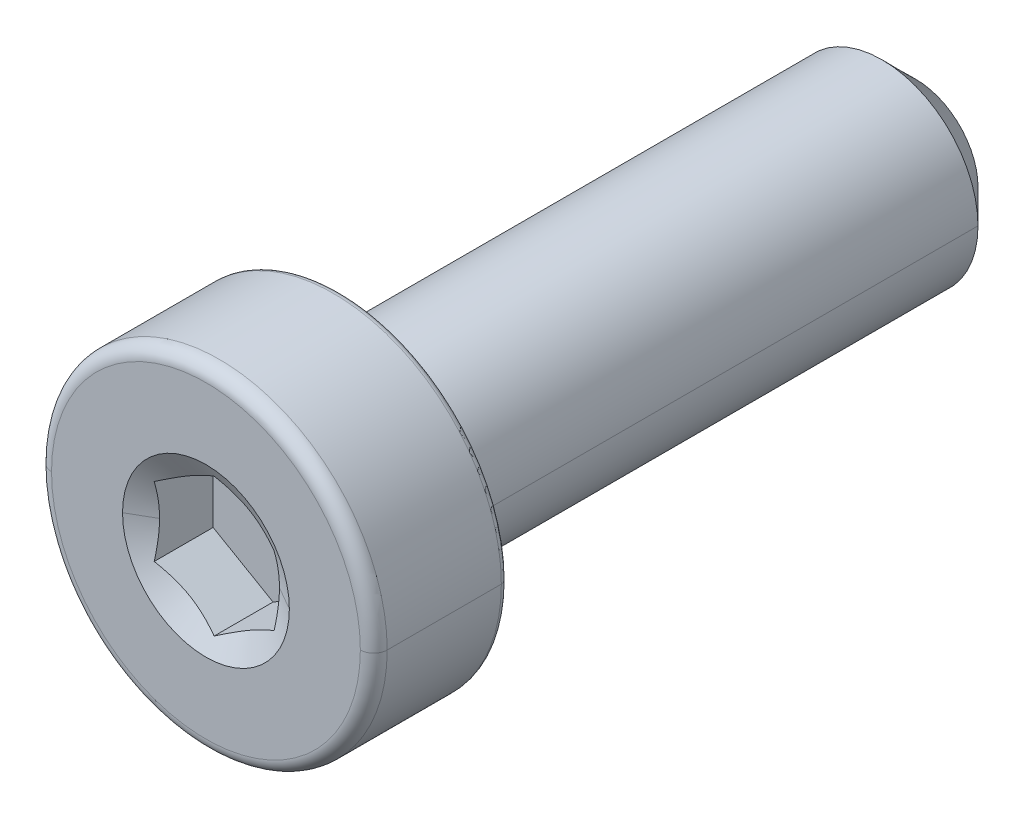
ISO-10303-21;
HEADER;
FILE_DESCRIPTION(('STEP AP214'),'2;1');
FILE_NAME('part.step','',(''),(''),'','','');
FILE_SCHEMA(('AUTOMOTIVE_DESIGN { 1 0 10303 214 1 1 1 1 }'));
ENDSEC;
DATA;
#1=APPLICATION_CONTEXT('core data for automotive mechanical design processes');
#2=APPLICATION_PROTOCOL_DEFINITION('international standard','automotive_design',2000,#1);
#3=PRODUCT_CONTEXT('',#1,'mechanical');
#4=PRODUCT('Part','Part','',(#3));
#5=PRODUCT_RELATED_PRODUCT_CATEGORY('part','',(#4));
#6=PRODUCT_DEFINITION_FORMATION('','',#4);
#7=PRODUCT_DEFINITION_CONTEXT('part definition',#1,'design');
#8=PRODUCT_DEFINITION('design','',#6,#7);
#9=PRODUCT_DEFINITION_SHAPE('','',#8);
#10=(LENGTH_UNIT() NAMED_UNIT(*) SI_UNIT(.MILLI.,.METRE.));
#11=(NAMED_UNIT(*) PLANE_ANGLE_UNIT() SI_UNIT($,.RADIAN.));
#12=(NAMED_UNIT(*) SI_UNIT($,.STERADIAN.) SOLID_ANGLE_UNIT());
#13=UNCERTAINTY_MEASURE_WITH_UNIT(LENGTH_MEASURE(1.E-05),#10,'distance_accuracy_value','');
#14=(GEOMETRIC_REPRESENTATION_CONTEXT(3) GLOBAL_UNCERTAINTY_ASSIGNED_CONTEXT((#13)) GLOBAL_UNIT_ASSIGNED_CONTEXT((#10,
#11,#12)) REPRESENTATION_CONTEXT('',''));
#15=CARTESIAN_POINT('',(0.,0.,0.));
#16=DIRECTION('',(0.,0.,1.));
#17=DIRECTION('',(1.,0.,0.));
#18=AXIS2_PLACEMENT_3D('',#15,#16,#17);
#19=CARTESIAN_POINT('',(0.,1.44337567297406,6.));
#20=DIRECTION('',(-0.5,0.866025403784439,0.));
#21=DIRECTION('',(0.,0.,1.));
#22=AXIS2_PLACEMENT_3D('',#19,#20,#21);
#23=PLANE('',#22);
#24=DIRECTION('',(0.,0.,1.));
#25=VECTOR('',#24,1.);
#26=CARTESIAN_POINT('',(0.,1.44337567297406,6.));
#27=LINE('',#26,#25);
#28=CARTESIAN_POINT('',(0.,1.44337567297406,6.));
#29=VERTEX_POINT('',#28);
#30=CARTESIAN_POINT('',(0.,1.44337567297406,7.22904424442379));
#31=VERTEX_POINT('',#30);
#32=EDGE_CURVE('E10',#29,#31,#27,.T.);
#33=ORIENTED_EDGE('',*,*,#32,.T.);
#34=CARTESIAN_POINT('',(0.,1.44337567297406,7.22904424442379));
#35=CARTESIAN_POINT('',(-0.3340328935037,1.25052169199151,7.11769994658444));
#36=CARTESIAN_POINT('',(-0.623808446138344,1.08321969867333,7.11739918476256));
#37=CARTESIAN_POINT('',(-0.914160739737196,0.915584723804206,7.11709782433372));
#38=CARTESIAN_POINT('',(-1.25,0.721687836487032,7.22904424442379));
#39=B_SPLINE_CURVE_WITH_KNOTS('',2,(#34,#35,#36,#37,#38),.UNSPECIFIED.,.F.,.F.,(3,2,3),(0.,0.5,
1.),.UNSPECIFIED.);
#40=CARTESIAN_POINT('',(-1.25,0.721687836487031,7.22904424442379));
#41=VERTEX_POINT('',#40);
#42=EDGE_CURVE('E179',#31,#41,#39,.T.);
#43=ORIENTED_EDGE('',*,*,#42,.T.);
#44=DIRECTION('',(0.,0.,1.));
#45=VECTOR('',#44,1.);
#46=CARTESIAN_POINT('',(-1.25,0.721687836487031,6.));
#47=LINE('',#46,#45);
#48=CARTESIAN_POINT('',(-1.25,0.721687836487031,6.));
#49=VERTEX_POINT('',#48);
#50=EDGE_CURVE('E173',#49,#41,#47,.T.);
#51=ORIENTED_EDGE('',*,*,#50,.F.);
#52=DIRECTION('',(-0.866025403784439,-0.5,0.));
#53=VECTOR('',#52,1.);
#54=CARTESIAN_POINT('',(0.,1.44337567297406,6.));
#55=LINE('',#54,#53);
#56=EDGE_CURVE('E417',#29,#49,#55,.T.);
#57=ORIENTED_EDGE('',*,*,#56,.F.);
#58=EDGE_LOOP('',(#33,#43,#51,#57));
#59=FACE_BOUND('',#58,.T.);
#60=ADVANCED_FACE('F15',(#59),#23,.F.);
#61=CARTESIAN_POINT('',(1.25,0.72168783648703,6.));
#62=DIRECTION('',(0.5,0.866025403784439,0.));
#63=DIRECTION('',(0.,0.,-1.));
#64=AXIS2_PLACEMENT_3D('',#61,#62,#63);
#65=PLANE('',#64);
#66=DIRECTION('',(0.,0.,1.));
#67=VECTOR('',#66,1.);
#68=CARTESIAN_POINT('',(1.25,0.72168783648703,6.));
#69=LINE('',#68,#67);
#70=CARTESIAN_POINT('',(1.25,0.72168783648703,6.));
#71=VERTEX_POINT('',#70);
#72=CARTESIAN_POINT('',(1.25,0.72168783648703,7.22904424442379));
#73=VERTEX_POINT('',#72);
#74=EDGE_CURVE('E27',#71,#73,#69,.T.);
#75=ORIENTED_EDGE('',*,*,#74,.T.);
#76=CARTESIAN_POINT('',(1.25,0.72168783648703,7.22904424442379));
#77=CARTESIAN_POINT('',(0.915967106494732,0.914541817470486,7.11769994658391));
#78=CARTESIAN_POINT('',(0.626191553861657,1.08184381078776,7.11739918476257));
#79=CARTESIAN_POINT('',(0.335839260261222,1.2494787856578,7.11709782433425));
#80=CARTESIAN_POINT('',(0.,1.44337567297406,7.22904424442379));
#81=B_SPLINE_CURVE_WITH_KNOTS('',2,(#76,#77,#78,#79,#80),.UNSPECIFIED.,.F.,.F.,(3,2,3),(0.,0.5,
1.),.UNSPECIFIED.);
#82=EDGE_CURVE('E404',#73,#31,#81,.T.);
#83=ORIENTED_EDGE('',*,*,#82,.T.);
#84=ORIENTED_EDGE('',*,*,#32,.F.);
#85=DIRECTION('',(-0.866025403784439,0.5,0.));
#86=VECTOR('',#85,1.);
#87=CARTESIAN_POINT('',(1.25,0.72168783648703,6.));
#88=LINE('',#87,#86);
#89=EDGE_CURVE('E269',#71,#29,#88,.T.);
#90=ORIENTED_EDGE('',*,*,#89,.F.);
#91=EDGE_LOOP('',(#75,#83,#84,#90));
#92=FACE_BOUND('',#91,.T.);
#93=ADVANCED_FACE('F308',(#92),#65,.F.);
#94=CARTESIAN_POINT('',(1.25,-0.721687836487031,6.));
#95=DIRECTION('',(1.,0.,0.));
#96=DIRECTION('',(0.,1.,0.));
#97=AXIS2_PLACEMENT_3D('',#94,#95,#96);
#98=PLANE('',#97);
#99=DIRECTION('',(0.,0.,1.));
#100=VECTOR('',#99,1.);
#101=CARTESIAN_POINT('',(1.25,-0.721687836487031,6.));
#102=LINE('',#101,#100);
#103=CARTESIAN_POINT('',(1.25,-0.721687836487031,6.));
#104=VERTEX_POINT('',#103);
#105=CARTESIAN_POINT('',(1.25,-0.721687836487031,7.22904424442379));
#106=VERTEX_POINT('',#105);
#107=EDGE_CURVE('E51',#104,#106,#102,.T.);
#108=ORIENTED_EDGE('',*,*,#107,.T.);
#109=CARTESIAN_POINT('',(1.25,-0.721687836487031,7.22904424442379));
#110=CARTESIAN_POINT('',(1.25,-0.334936490529253,7.1173987475747));
#111=CARTESIAN_POINT('',(1.25,2.57064335096313E-13,7.1173987475747));
#112=B_SPLINE_CURVE_WITH_KNOTS('',2,(#109,#110,#111),.UNSPECIFIED.,.F.,.F.,(3,3),(0.,1.),.UNSPECIFIED.);
#113=CARTESIAN_POINT('',(1.25,2.5675760577183E-13,7.1173987475747));
#114=VERTEX_POINT('',#113);
#115=EDGE_CURVE('E325',#106,#114,#112,.T.);
#116=ORIENTED_EDGE('',*,*,#115,.T.);
#117=CARTESIAN_POINT('',(1.25,2.57064335096313E-13,7.1173987475747));
#118=CARTESIAN_POINT('',(1.25,0.178322210871906,7.1173987475747));
#119=CARTESIAN_POINT('',(1.25,0.366220993478989,7.14773436286669));
#120=CARTESIAN_POINT('',(1.25,0.533672056437585,7.17476876381207));
#121=CARTESIAN_POINT('',(1.25,0.721687836487029,7.22904424442379));
#122=B_SPLINE_CURVE_WITH_KNOTS('',2,(#117,#118,#119,#120,#121),.UNSPECIFIED.,.F.,.F.,(3,2,3),
(0.,0.5,1.),.UNSPECIFIED.);
#123=EDGE_CURVE('E294',#114,#73,#122,.T.);
#124=ORIENTED_EDGE('',*,*,#123,.T.);
#125=ORIENTED_EDGE('',*,*,#74,.F.);
#126=DIRECTION('',(0.,1.,0.));
#127=VECTOR('',#126,1.);
#128=CARTESIAN_POINT('',(1.25,-0.721687836487031,6.));
#129=LINE('',#128,#127);
#130=EDGE_CURVE('E279',#104,#71,#129,.T.);
#131=ORIENTED_EDGE('',*,*,#130,.F.);
#132=EDGE_LOOP('',(#108,#116,#124,#125,#131));
#133=FACE_BOUND('',#132,.T.);
#134=ADVANCED_FACE('F299',(#133),#98,.F.);
#135=CARTESIAN_POINT('',(0.,-1.44337567297406,6.));
#136=DIRECTION('',(0.5,-0.866025403784438,0.));
#137=DIRECTION('',(0.,0.,-1.));
#138=AXIS2_PLACEMENT_3D('',#135,#136,#137);
#139=PLANE('',#138);
#140=DIRECTION('',(0.,0.,1.));
#141=VECTOR('',#140,1.);
#142=CARTESIAN_POINT('',(0.,-1.44337567297406,6.));
#143=LINE('',#142,#141);
#144=CARTESIAN_POINT('',(0.,-1.44337567297406,6.));
#145=VERTEX_POINT('',#144);
#146=CARTESIAN_POINT('',(0.,-1.44337567297406,7.22904424442379));
#147=VERTEX_POINT('',#146);
#148=EDGE_CURVE('E276',#145,#147,#143,.T.);
#149=ORIENTED_EDGE('',*,*,#148,.T.);
#150=CARTESIAN_POINT('',(0.,-1.44337567297406,7.22904424442379));
#151=CARTESIAN_POINT('',(0.33403289350289,-1.25052169199198,7.11769994658471));
#152=CARTESIAN_POINT('',(0.623808446138341,-1.08321969867333,7.11739918476256));
#153=CARTESIAN_POINT('',(0.914160739736387,-0.91558472380467,7.11709782433346));
#154=CARTESIAN_POINT('',(1.25,-0.721687836487031,7.22904424442379));
#155=B_SPLINE_CURVE_WITH_KNOTS('',2,(#150,#151,#152,#153,#154),.UNSPECIFIED.,.F.,.F.,(3,2,3),
(0.,0.5,1.),.UNSPECIFIED.);
#156=EDGE_CURVE('E372',#147,#106,#155,.T.);
#157=ORIENTED_EDGE('',*,*,#156,.T.);
#158=ORIENTED_EDGE('',*,*,#107,.F.);
#159=DIRECTION('',(0.866025403784438,0.5,0.));
#160=VECTOR('',#159,1.);
#161=CARTESIAN_POINT('',(0.,-1.44337567297406,6.));
#162=LINE('',#161,#160);
#163=EDGE_CURVE('E288',#145,#104,#162,.T.);
#164=ORIENTED_EDGE('',*,*,#163,.F.);
#165=EDGE_LOOP('',(#149,#157,#158,#164));
#166=FACE_BOUND('',#165,.T.);
#167=ADVANCED_FACE('F307',(#166),#139,.F.);
#168=CARTESIAN_POINT('',(-1.25,-0.721687836487033,6.));
#169=DIRECTION('',(-0.5,-0.866025403784439,0.));
#170=DIRECTION('',(-0.866025403784439,0.5,0.));
#171=AXIS2_PLACEMENT_3D('',#168,#169,#170);
#172=PLANE('',#171);
#173=DIRECTION('',(0.,0.,1.));
#174=VECTOR('',#173,1.);
#175=CARTESIAN_POINT('',(-1.25,-0.721687836487033,6.));
#176=LINE('',#175,#174);
#177=CARTESIAN_POINT('',(-1.25,-0.721687836487033,6.));
#178=VERTEX_POINT('',#177);
#179=CARTESIAN_POINT('',(-1.25,-0.721687836487033,7.22904424442379));
#180=VERTEX_POINT('',#179);
#181=EDGE_CURVE('E268',#178,#180,#176,.T.);
#182=ORIENTED_EDGE('',*,*,#181,.T.);
#183=CARTESIAN_POINT('',(-1.25,-0.721687836487033,7.22904424442379));
#184=CARTESIAN_POINT('',(-0.915967106495508,-0.914541817470041,7.11769994658418));
#185=CARTESIAN_POINT('',(-0.626191553861659,-1.08184381078777,7.11739918476256));
#186=CARTESIAN_POINT('',(-0.335839260262025,-1.24947878565734,7.11709782433399));
#187=CARTESIAN_POINT('',(0.,-1.44337567297406,7.22904424442379));
#188=B_SPLINE_CURVE_WITH_KNOTS('',2,(#183,#184,#185,#186,#187),.UNSPECIFIED.,.F.,.F.,(3,2,3),
(0.,0.5,1.),.UNSPECIFIED.);
#189=EDGE_CURVE('E197',#180,#147,#188,.T.);
#190=ORIENTED_EDGE('',*,*,#189,.T.);
#191=ORIENTED_EDGE('',*,*,#148,.F.);
#192=DIRECTION('',(0.866025403784439,-0.5,0.));
#193=VECTOR('',#192,1.);
#194=CARTESIAN_POINT('',(-1.25,-0.721687836487033,6.));
#195=LINE('',#194,#193);
#196=EDGE_CURVE('E435',#178,#145,#195,.T.);
#197=ORIENTED_EDGE('',*,*,#196,.F.);
#198=EDGE_LOOP('',(#182,#190,#191,#197));
#199=FACE_BOUND('',#198,.T.);
#200=ADVANCED_FACE('F215',(#199),#172,.F.);
#201=CARTESIAN_POINT('',(-1.25,0.721687836487031,6.));
#202=DIRECTION('',(-1.,0.,0.));
#203=DIRECTION('',(0.,1.,0.));
#204=AXIS2_PLACEMENT_3D('',#201,#202,#203);
#205=PLANE('',#204);
#206=ORIENTED_EDGE('',*,*,#50,.T.);
#207=CARTESIAN_POINT('',(-1.25,0.721687836487031,7.22904424442379));
#208=CARTESIAN_POINT('',(-1.25,0.535963830685296,7.17543034205148));
#209=CARTESIAN_POINT('',(-1.25,0.366220993478988,7.1477343628667));
#210=CARTESIAN_POINT('',(-1.25,0.180300381186946,7.1173987475747));
#211=CARTESIAN_POINT('',(-1.25,2.56955914879065E-13,7.1173987475747));
#212=B_SPLINE_CURVE_WITH_KNOTS('',2,(#207,#208,#209,#210,#211),.UNSPECIFIED.,.F.,.F.,(3,2,3),
(0.,0.5,1.),.UNSPECIFIED.);
#213=CARTESIAN_POINT('',(-1.25,2.56910687124712E-13,7.1173987475747));
#214=VERTEX_POINT('',#213);
#215=EDGE_CURVE('E165',#41,#214,#212,.T.);
#216=ORIENTED_EDGE('',*,*,#215,.T.);
#217=CARTESIAN_POINT('',(-1.25,2.56955914879065E-13,7.1173987475747));
#218=CARTESIAN_POINT('',(-1.25,-0.334936490529255,7.1173987475747));
#219=CARTESIAN_POINT('',(-1.25,-0.721687836487033,7.22904424442379));
#220=B_SPLINE_CURVE_WITH_KNOTS('',2,(#217,#218,#219),.UNSPECIFIED.,.F.,.F.,(3,3),(0.,1.),.UNSPECIFIED.);
#221=EDGE_CURVE('E170',#214,#180,#220,.T.);
#222=ORIENTED_EDGE('',*,*,#221,.T.);
#223=ORIENTED_EDGE('',*,*,#181,.F.);
#224=DIRECTION('',(0.,-1.,0.));
#225=VECTOR('',#224,1.);
#226=CARTESIAN_POINT('',(-1.25,0.721687836487031,6.));
#227=LINE('',#226,#225);
#228=EDGE_CURVE('E440',#49,#178,#227,.T.);
#229=ORIENTED_EDGE('',*,*,#228,.F.);
#230=EDGE_LOOP('',(#206,#216,#222,#223,#229));
#231=FACE_BOUND('',#230,.T.);
#232=ADVANCED_FACE('F168',(#231),#205,.F.);
#233=CARTESIAN_POINT('',(0.,0.,6.));
#234=DIRECTION('',(0.,0.,1.));
#235=DIRECTION('',(1.,0.,0.));
#236=AXIS2_PLACEMENT_3D('',#233,#234,#235);
#237=PLANE('',#236);
#238=ORIENTED_EDGE('',*,*,#56,.T.);
#239=ORIENTED_EDGE('',*,*,#228,.T.);
#240=ORIENTED_EDGE('',*,*,#196,.T.);
#241=ORIENTED_EDGE('',*,*,#163,.T.);
#242=ORIENTED_EDGE('',*,*,#130,.T.);
#243=ORIENTED_EDGE('',*,*,#89,.T.);
#244=EDGE_LOOP('',(#238,#239,#240,#241,#242,#243));
#245=FACE_BOUND('',#244,.T.);
#246=ADVANCED_FACE('F214',(#245),#237,.T.);
#247=CARTESIAN_POINT('',(0.,0.,7.4));
#248=DIRECTION('',(0.,0.,1.));
#249=DIRECTION('',(1.,0.,0.));
#250=AXIS2_PLACEMENT_3D('',#247,#248,#249);
#251=CONICAL_SURFACE('',#250,1.73947972747839,1.0471975511966);
#252=DIRECTION('',(-0.86602540378444,0.,0.5));
#253=VECTOR('',#252,1.);
#254=CARTESIAN_POINT('',(-1.73947972747839,0.,7.4));
#255=LINE('',#254,#253);
#256=CARTESIAN_POINT('',(-1.73947972747839,0.,7.4));
#257=VERTEX_POINT('',#256);
#258=EDGE_CURVE('E184',#214,#257,#255,.T.);
#259=ORIENTED_EDGE('',*,*,#258,.F.);
#260=ORIENTED_EDGE('',*,*,#215,.F.);
#261=ORIENTED_EDGE('',*,*,#42,.F.);
#262=ORIENTED_EDGE('',*,*,#82,.F.);
#263=ORIENTED_EDGE('',*,*,#123,.F.);
#264=DIRECTION('',(0.86602540378444,0.,0.5));
#265=VECTOR('',#264,1.);
#266=CARTESIAN_POINT('',(1.73947972747839,0.,7.4));
#267=LINE('',#266,#265);
#268=CARTESIAN_POINT('',(1.73947972747839,0.,7.4));
#269=VERTEX_POINT('',#268);
#270=EDGE_CURVE('E388',#114,#269,#267,.T.);
#271=ORIENTED_EDGE('',*,*,#270,.T.);
#272=CARTESIAN_POINT('',(0.,0.,7.4));
#273=DIRECTION('',(0.,0.,1.));
#274=DIRECTION('',(1.,0.,0.));
#275=AXIS2_PLACEMENT_3D('',#272,#273,#274);
#276=CIRCLE('',#275,1.73947972747839);
#277=EDGE_CURVE('E180',#269,#257,#276,.T.);
#278=ORIENTED_EDGE('',*,*,#277,.T.);
#279=EDGE_LOOP('',(#259,#260,#261,#262,#263,#271,#278));
#280=FACE_BOUND('',#279,.T.);
#281=ADVANCED_FACE('F185',(#280),#251,.F.);
#282=CARTESIAN_POINT('',(0.,3.22,7.4));
#283=DIRECTION('',(0.,0.,1.));
#284=DIRECTION('',(1.,0.,0.));
#285=AXIS2_PLACEMENT_3D('',#282,#283,#284);
#286=PLANE('',#285);
#287=ORIENTED_EDGE('',*,*,#277,.F.);
#288=CARTESIAN_POINT('',(0.,0.,7.4));
#289=DIRECTION('',(0.,0.,1.));
#290=DIRECTION('',(1.,0.,0.));
#291=AXIS2_PLACEMENT_3D('',#288,#289,#290);
#292=CIRCLE('',#291,1.73947972747839);
#293=EDGE_CURVE('E191',#257,#269,#292,.T.);
#294=ORIENTED_EDGE('',*,*,#293,.F.);
#295=EDGE_LOOP('',(#287,#294));
#296=FACE_BOUND('',#295,.T.);
#297=CARTESIAN_POINT('',(0.,0.,7.4));
#298=DIRECTION('',(0.,0.,-1.));
#299=DIRECTION('',(-1.,0.,0.));
#300=AXIS2_PLACEMENT_3D('',#297,#298,#299);
#301=CIRCLE('',#300,3.22);
#302=CARTESIAN_POINT('',(-3.22,0.,7.4));
#303=VERTEX_POINT('',#302);
#304=CARTESIAN_POINT('',(3.22,0.,7.4));
#305=VERTEX_POINT('',#304);
#306=EDGE_CURVE('E386',#303,#305,#301,.T.);
#307=ORIENTED_EDGE('',*,*,#306,.F.);
#308=CARTESIAN_POINT('',(0.,0.,7.4));
#309=DIRECTION('',(0.,0.,-1.));
#310=DIRECTION('',(-1.,0.,0.));
#311=AXIS2_PLACEMENT_3D('',#308,#309,#310);
#312=CIRCLE('',#311,3.22);
#313=EDGE_CURVE('E447',#305,#303,#312,.T.);
#314=ORIENTED_EDGE('',*,*,#313,.F.);
#315=EDGE_LOOP('',(#307,#314));
#316=FACE_BOUND('',#315,.T.);
#317=ADVANCED_FACE('F241',(#296,#316),#286,.T.);
#318=CARTESIAN_POINT('',(0.,0.,7.12));
#319=DIRECTION('',(0.,0.,-1.));
#320=DIRECTION('',(-1.,0.,0.));
#321=AXIS2_PLACEMENT_3D('',#318,#319,#320);
#322=TOROIDAL_SURFACE('',#321,3.22,0.28);
#323=CARTESIAN_POINT('',(3.22,0.,7.12));
#324=DIRECTION('',(0.,1.,0.));
#325=DIRECTION('',(-1.,0.,0.));
#326=AXIS2_PLACEMENT_3D('',#323,#324,#325);
#327=CIRCLE('',#326,0.28);
#328=CARTESIAN_POINT('',(3.5,0.,7.12));
#329=VERTEX_POINT('',#328);
#330=EDGE_CURVE('E519',#305,#329,#327,.T.);
#331=ORIENTED_EDGE('',*,*,#330,.F.);
#332=ORIENTED_EDGE('',*,*,#313,.T.);
#333=CARTESIAN_POINT('',(-3.22,0.,7.12));
#334=DIRECTION('',(0.,-1.,0.));
#335=DIRECTION('',(0.,0.,-1.));
#336=AXIS2_PLACEMENT_3D('',#333,#334,#335);
#337=CIRCLE('',#336,0.28);
#338=CARTESIAN_POINT('',(-3.5,0.,7.12));
#339=VERTEX_POINT('',#338);
#340=EDGE_CURVE('E505',#303,#339,#337,.T.);
#341=ORIENTED_EDGE('',*,*,#340,.T.);
#342=CARTESIAN_POINT('',(0.,0.,7.12));
#343=DIRECTION('',(0.,0.,-1.));
#344=DIRECTION('',(-1.,0.,0.));
#345=AXIS2_PLACEMENT_3D('',#342,#343,#344);
#346=CIRCLE('',#345,3.5);
#347=EDGE_CURVE('E444',#329,#339,#346,.T.);
#348=ORIENTED_EDGE('',*,*,#347,.F.);
#349=EDGE_LOOP('',(#331,#332,#341,#348));
#350=FACE_BOUND('',#349,.T.);
#351=ADVANCED_FACE('F216',(#350),#322,.T.);
#352=CARTESIAN_POINT('',(0.,0.,-7.4));
#353=DIRECTION('',(0.,0.,-1.));
#354=DIRECTION('',(-1.,0.,0.));
#355=AXIS2_PLACEMENT_3D('',#352,#353,#354);
#356=CYLINDRICAL_SURFACE('',#355,3.5);
#357=DIRECTION('',(0.,0.,-1.));
#358=VECTOR('',#357,1.);
#359=CARTESIAN_POINT('',(3.5,0.,-7.4));
#360=LINE('',#359,#358);
#361=CARTESIAN_POINT('',(3.5,0.,4.74));
#362=VERTEX_POINT('',#361);
#363=EDGE_CURVE('E501',#329,#362,#360,.T.);
#364=ORIENTED_EDGE('',*,*,#363,.F.);
#365=ORIENTED_EDGE('',*,*,#347,.T.);
#366=DIRECTION('',(0.,0.,-1.));
#367=VECTOR('',#366,1.);
#368=CARTESIAN_POINT('',(-3.5,0.,-7.4));
#369=LINE('',#368,#367);
#370=CARTESIAN_POINT('',(-3.5,0.,4.74));
#371=VERTEX_POINT('',#370);
#372=EDGE_CURVE('E506',#339,#371,#369,.T.);
#373=ORIENTED_EDGE('',*,*,#372,.T.);
#374=CARTESIAN_POINT('',(0.,0.,4.74));
#375=DIRECTION('',(0.,0.,-1.));
#376=DIRECTION('',(-1.,0.,0.));
#377=AXIS2_PLACEMENT_3D('',#374,#375,#376);
#378=CIRCLE('',#377,3.5);
#379=EDGE_CURVE('E448',#362,#371,#378,.T.);
#380=ORIENTED_EDGE('',*,*,#379,.F.);
#381=EDGE_LOOP('',(#364,#365,#373,#380));
#382=FACE_BOUND('',#381,.T.);
#383=ADVANCED_FACE('F565',(#382),#356,.T.);
#384=CARTESIAN_POINT('',(0.,0.,4.74));
#385=DIRECTION('',(0.,0.,-1.));
#386=DIRECTION('',(-1.,0.,0.));
#387=AXIS2_PLACEMENT_3D('',#384,#385,#386);
#388=TOROIDAL_SURFACE('',#387,3.36,0.14);
#389=CARTESIAN_POINT('',(3.36,0.,4.74));
#390=DIRECTION('',(0.,1.,0.));
#391=DIRECTION('',(-1.,0.,0.));
#392=AXIS2_PLACEMENT_3D('',#389,#390,#391);
#393=CIRCLE('',#392,0.14);
#394=CARTESIAN_POINT('',(3.36,0.,4.6));
#395=VERTEX_POINT('',#394);
#396=EDGE_CURVE('E500',#362,#395,#393,.T.);
#397=ORIENTED_EDGE('',*,*,#396,.F.);
#398=ORIENTED_EDGE('',*,*,#379,.T.);
#399=CARTESIAN_POINT('',(-3.36,0.,4.74));
#400=DIRECTION('',(0.,-1.,0.));
#401=DIRECTION('',(0.,0.,-1.));
#402=AXIS2_PLACEMENT_3D('',#399,#400,#401);
#403=CIRCLE('',#402,0.14);
#404=CARTESIAN_POINT('',(-3.36,0.,4.6));
#405=VERTEX_POINT('',#404);
#406=EDGE_CURVE('E493',#371,#405,#403,.T.);
#407=ORIENTED_EDGE('',*,*,#406,.T.);
#408=CARTESIAN_POINT('',(0.,0.,4.6));
#409=DIRECTION('',(0.,0.,-1.));
#410=DIRECTION('',(-1.,0.,0.));
#411=AXIS2_PLACEMENT_3D('',#408,#409,#410);
#412=CIRCLE('',#411,3.36);
#413=EDGE_CURVE('E451',#395,#405,#412,.T.);
#414=ORIENTED_EDGE('',*,*,#413,.F.);
#415=EDGE_LOOP('',(#397,#398,#407,#414));
#416=FACE_BOUND('',#415,.T.);
#417=ADVANCED_FACE('F554',(#416),#388,.T.);
#418=CARTESIAN_POINT('',(0.,2.,4.6));
#419=DIRECTION('',(0.,0.,-1.));
#420=DIRECTION('',(0.,-1.,0.));
#421=AXIS2_PLACEMENT_3D('',#418,#419,#420);
#422=PLANE('',#421);
#423=CARTESIAN_POINT('',(0.,0.,4.6));
#424=DIRECTION('',(0.,0.,-1.));
#425=DIRECTION('',(-1.,0.,0.));
#426=AXIS2_PLACEMENT_3D('',#423,#424,#425);
#427=CIRCLE('',#426,2.);
#428=CARTESIAN_POINT('',(-2.,0.,4.6));
#429=VERTEX_POINT('',#428);
#430=CARTESIAN_POINT('',(2.,0.,4.6));
#431=VERTEX_POINT('',#430);
#432=EDGE_CURVE('E485',#429,#431,#427,.T.);
#433=ORIENTED_EDGE('',*,*,#432,.F.);
#434=CARTESIAN_POINT('',(0.,0.,4.6));
#435=DIRECTION('',(0.,0.,-1.));
#436=DIRECTION('',(-1.,0.,0.));
#437=AXIS2_PLACEMENT_3D('',#434,#435,#436);
#438=CIRCLE('',#437,2.);
#439=EDGE_CURVE('E454',#431,#429,#438,.T.);
#440=ORIENTED_EDGE('',*,*,#439,.F.);
#441=EDGE_LOOP('',(#433,#440));
#442=FACE_BOUND('',#441,.T.);
#443=CARTESIAN_POINT('',(0.,0.,4.6));
#444=DIRECTION('',(0.,0.,-1.));
#445=DIRECTION('',(-1.,0.,0.));
#446=AXIS2_PLACEMENT_3D('',#443,#444,#445);
#447=CIRCLE('',#446,3.36);
#448=EDGE_CURVE('E497',#405,#395,#447,.T.);
#449=ORIENTED_EDGE('',*,*,#448,.T.);
#450=ORIENTED_EDGE('',*,*,#413,.T.);
#451=EDGE_LOOP('',(#449,#450));
#452=FACE_BOUND('',#451,.T.);
#453=ADVANCED_FACE('F551',(#442,#452),#422,.T.);
#454=CARTESIAN_POINT('',(0.,0.,-7.4));
#455=DIRECTION('',(0.,0.,-1.));
#456=DIRECTION('',(-1.,0.,0.));
#457=AXIS2_PLACEMENT_3D('',#454,#455,#456);
#458=CYLINDRICAL_SURFACE('',#457,2.);
#459=DIRECTION('',(0.,0.,-1.));
#460=VECTOR('',#459,1.);
#461=CARTESIAN_POINT('',(2.,0.,-7.4));
#462=LINE('',#461,#460);
#463=CARTESIAN_POINT('',(2.,0.,-6.7));
#464=VERTEX_POINT('',#463);
#465=EDGE_CURVE('E481',#431,#464,#462,.T.);
#466=ORIENTED_EDGE('',*,*,#465,.F.);
#467=ORIENTED_EDGE('',*,*,#439,.T.);
#468=DIRECTION('',(0.,0.,-1.));
#469=VECTOR('',#468,1.);
#470=CARTESIAN_POINT('',(-2.,0.,-7.4));
#471=LINE('',#470,#469);
#472=CARTESIAN_POINT('',(-2.,0.,-6.7));
#473=VERTEX_POINT('',#472);
#474=EDGE_CURVE('E473',#429,#473,#471,.T.);
#475=ORIENTED_EDGE('',*,*,#474,.T.);
#476=CARTESIAN_POINT('',(0.,0.,-6.7));
#477=DIRECTION('',(0.,0.,-1.));
#478=DIRECTION('',(-1.,0.,0.));
#479=AXIS2_PLACEMENT_3D('',#476,#477,#478);
#480=CIRCLE('',#479,2.);
#481=EDGE_CURVE('E457',#464,#473,#480,.T.);
#482=ORIENTED_EDGE('',*,*,#481,.F.);
#483=EDGE_LOOP('',(#466,#467,#475,#482));
#484=FACE_BOUND('',#483,.T.);
#485=ADVANCED_FACE('F549',(#484),#458,.T.);
#486=CARTESIAN_POINT('',(0.,0.,-7.4));
#487=DIRECTION('',(0.,0.,1.));
#488=DIRECTION('',(1.,0.,0.));
#489=AXIS2_PLACEMENT_3D('',#486,#487,#488);
#490=CONICAL_SURFACE('',#489,1.3,0.785398163397449);
#491=DIRECTION('',(-0.707106781186548,0.,0.707106781186547));
#492=VECTOR('',#491,1.);
#493=CARTESIAN_POINT('',(-1.3,0.,-7.4));
#494=LINE('',#493,#492);
#495=CARTESIAN_POINT('',(-1.3,0.,-7.4));
#496=VERTEX_POINT('',#495);
#497=EDGE_CURVE('E465',#496,#473,#494,.T.);
#498=ORIENTED_EDGE('',*,*,#497,.F.);
#499=CARTESIAN_POINT('',(0.,0.,-7.4));
#500=DIRECTION('',(0.,0.,-1.));
#501=DIRECTION('',(-1.,0.,0.));
#502=AXIS2_PLACEMENT_3D('',#499,#500,#501);
#503=CIRCLE('',#502,1.3);
#504=CARTESIAN_POINT('',(1.3,0.,-7.4));
#505=VERTEX_POINT('',#504);
#506=EDGE_CURVE('E460',#505,#496,#503,.T.);
#507=ORIENTED_EDGE('',*,*,#506,.F.);
#508=DIRECTION('',(0.707106781186548,0.,0.707106781186547));
#509=VECTOR('',#508,1.);
#510=CARTESIAN_POINT('',(1.3,0.,-7.4));
#511=LINE('',#510,#509);
#512=EDGE_CURVE('E461',#505,#464,#511,.T.);
#513=ORIENTED_EDGE('',*,*,#512,.T.);
#514=ORIENTED_EDGE('',*,*,#481,.T.);
#515=EDGE_LOOP('',(#498,#507,#513,#514));
#516=FACE_BOUND('',#515,.T.);
#517=ADVANCED_FACE('F540',(#516),#490,.T.);
#518=CARTESIAN_POINT('',(0.,0.,-7.4));
#519=DIRECTION('',(0.,0.,-1.));
#520=DIRECTION('',(0.,-1.,0.));
#521=AXIS2_PLACEMENT_3D('',#518,#519,#520);
#522=PLANE('',#521);
#523=ORIENTED_EDGE('',*,*,#506,.T.);
#524=CARTESIAN_POINT('',(0.,0.,-7.4));
#525=DIRECTION('',(0.,0.,-1.));
#526=DIRECTION('',(-1.,0.,0.));
#527=AXIS2_PLACEMENT_3D('',#524,#525,#526);
#528=CIRCLE('',#527,1.3);
#529=EDGE_CURVE('E469',#496,#505,#528,.T.);
#530=ORIENTED_EDGE('',*,*,#529,.T.);
#531=EDGE_LOOP('',(#523,#530));
#532=FACE_BOUND('',#531,.T.);
#533=ADVANCED_FACE('F536',(#532),#522,.T.);
#534=CARTESIAN_POINT('',(0.,0.,-7.4));
#535=DIRECTION('',(0.,0.,1.));
#536=DIRECTION('',(1.,0.,0.));
#537=AXIS2_PLACEMENT_3D('',#534,#535,#536);
#538=CONICAL_SURFACE('',#537,1.3,0.785398163397449);
#539=ORIENTED_EDGE('',*,*,#529,.F.);
#540=ORIENTED_EDGE('',*,*,#497,.T.);
#541=CARTESIAN_POINT('',(0.,0.,-6.7));
#542=DIRECTION('',(0.,0.,-1.));
#543=DIRECTION('',(-1.,0.,0.));
#544=AXIS2_PLACEMENT_3D('',#541,#542,#543);
#545=CIRCLE('',#544,2.);
#546=EDGE_CURVE('E477',#473,#464,#545,.T.);
#547=ORIENTED_EDGE('',*,*,#546,.T.);
#548=ORIENTED_EDGE('',*,*,#512,.F.);
#549=EDGE_LOOP('',(#539,#540,#547,#548));
#550=FACE_BOUND('',#549,.T.);
#551=ADVANCED_FACE('F542',(#550),#538,.T.);
#552=CARTESIAN_POINT('',(0.,0.,-7.4));
#553=DIRECTION('',(0.,0.,-1.));
#554=DIRECTION('',(-1.,0.,0.));
#555=AXIS2_PLACEMENT_3D('',#552,#553,#554);
#556=CYLINDRICAL_SURFACE('',#555,2.);
#557=ORIENTED_EDGE('',*,*,#432,.T.);
#558=ORIENTED_EDGE('',*,*,#465,.T.);
#559=ORIENTED_EDGE('',*,*,#546,.F.);
#560=ORIENTED_EDGE('',*,*,#474,.F.);
#561=EDGE_LOOP('',(#557,#558,#559,#560));
#562=FACE_BOUND('',#561,.T.);
#563=ADVANCED_FACE('F242',(#562),#556,.T.);
#564=CARTESIAN_POINT('',(0.,0.,4.74));
#565=DIRECTION('',(0.,0.,-1.));
#566=DIRECTION('',(-1.,0.,0.));
#567=AXIS2_PLACEMENT_3D('',#564,#565,#566);
#568=TOROIDAL_SURFACE('',#567,3.36,0.14);
#569=CARTESIAN_POINT('',(0.,0.,4.74));
#570=DIRECTION('',(0.,0.,-1.));
#571=DIRECTION('',(-1.,0.,0.));
#572=AXIS2_PLACEMENT_3D('',#569,#570,#571);
#573=CIRCLE('',#572,3.5);
#574=EDGE_CURVE('E504',#371,#362,#573,.T.);
#575=ORIENTED_EDGE('',*,*,#574,.T.);
#576=ORIENTED_EDGE('',*,*,#396,.T.);
#577=ORIENTED_EDGE('',*,*,#448,.F.);
#578=ORIENTED_EDGE('',*,*,#406,.F.);
#579=EDGE_LOOP('',(#575,#576,#577,#578));
#580=FACE_BOUND('',#579,.T.);
#581=ADVANCED_FACE('F337',(#580),#568,.T.);
#582=CARTESIAN_POINT('',(0.,0.,-7.4));
#583=DIRECTION('',(0.,0.,-1.));
#584=DIRECTION('',(-1.,0.,0.));
#585=AXIS2_PLACEMENT_3D('',#582,#583,#584);
#586=CYLINDRICAL_SURFACE('',#585,3.5);
#587=CARTESIAN_POINT('',(0.,0.,7.12));
#588=DIRECTION('',(0.,0.,-1.));
#589=DIRECTION('',(-1.,0.,0.));
#590=AXIS2_PLACEMENT_3D('',#587,#588,#589);
#591=CIRCLE('',#590,3.5);
#592=EDGE_CURVE('E515',#339,#329,#591,.T.);
#593=ORIENTED_EDGE('',*,*,#592,.T.);
#594=ORIENTED_EDGE('',*,*,#363,.T.);
#595=ORIENTED_EDGE('',*,*,#574,.F.);
#596=ORIENTED_EDGE('',*,*,#372,.F.);
#597=EDGE_LOOP('',(#593,#594,#595,#596));
#598=FACE_BOUND('',#597,.T.);
#599=ADVANCED_FACE('F567',(#598),#586,.T.);
#600=CARTESIAN_POINT('',(0.,0.,7.12));
#601=DIRECTION('',(0.,0.,-1.));
#602=DIRECTION('',(-1.,0.,0.));
#603=AXIS2_PLACEMENT_3D('',#600,#601,#602);
#604=TOROIDAL_SURFACE('',#603,3.22,0.28);
#605=ORIENTED_EDGE('',*,*,#306,.T.);
#606=ORIENTED_EDGE('',*,*,#330,.T.);
#607=ORIENTED_EDGE('',*,*,#592,.F.);
#608=ORIENTED_EDGE('',*,*,#340,.F.);
#609=EDGE_LOOP('',(#605,#606,#607,#608));
#610=FACE_BOUND('',#609,.T.);
#611=ADVANCED_FACE('F336',(#610),#604,.T.);
#612=CARTESIAN_POINT('',(0.,0.,7.4));
#613=DIRECTION('',(0.,0.,1.));
#614=DIRECTION('',(1.,0.,0.));
#615=AXIS2_PLACEMENT_3D('',#612,#613,#614);
#616=CONICAL_SURFACE('',#615,1.73947972747839,1.0471975511966);
#617=ORIENTED_EDGE('',*,*,#221,.F.);
#618=ORIENTED_EDGE('',*,*,#258,.T.);
#619=ORIENTED_EDGE('',*,*,#293,.T.);
#620=ORIENTED_EDGE('',*,*,#270,.F.);
#621=ORIENTED_EDGE('',*,*,#115,.F.);
#622=ORIENTED_EDGE('',*,*,#156,.F.);
#623=ORIENTED_EDGE('',*,*,#189,.F.);
#624=EDGE_LOOP('',(#617,#618,#619,#620,#621,#622,#623));
#625=FACE_BOUND('',#624,.T.);
#626=ADVANCED_FACE('F194',(#625),#616,.F.);
#627=CLOSED_SHELL('',(#60,#93,#134,#167,#200,#232,#246,#281,#317,#351,#383,#417,#453,#485,#517,
#533,#551,#563,#581,#599,#611,#626));
#628=MANIFOLD_SOLID_BREP('B1',#627);
#629=ADVANCED_BREP_SHAPE_REPRESENTATION('',(#18,#628),#14);
#630=SHAPE_DEFINITION_REPRESENTATION(#9,#629);
ENDSEC;
END-ISO-10303-21;
